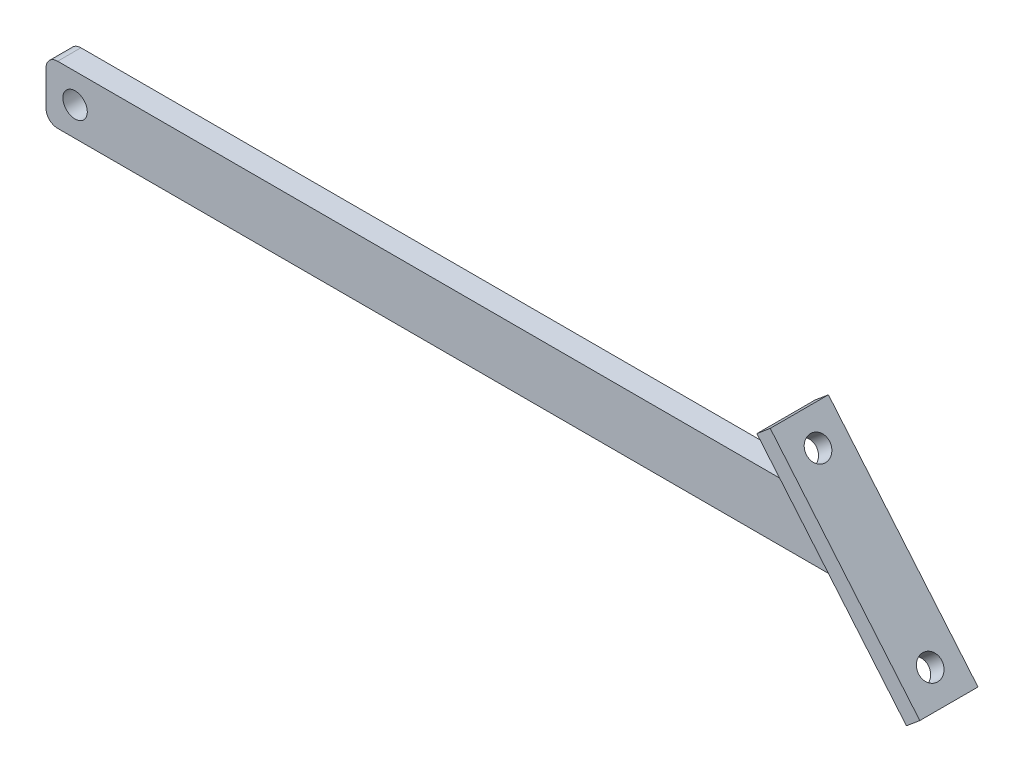
ISO-10303-21;
HEADER;
FILE_DESCRIPTION(('STEP AP214'),'2;1');
FILE_NAME('part.step','',(''),(''),'','','');
FILE_SCHEMA(('AUTOMOTIVE_DESIGN { 1 0 10303 214 1 1 1 1 }'));
ENDSEC;
DATA;
#1=APPLICATION_CONTEXT('core data for automotive mechanical design processes');
#2=APPLICATION_PROTOCOL_DEFINITION('international standard','automotive_design',2000,#1);
#3=PRODUCT_CONTEXT('',#1,'mechanical');
#4=PRODUCT('Part','Part','',(#3));
#5=PRODUCT_RELATED_PRODUCT_CATEGORY('part','',(#4));
#6=PRODUCT_DEFINITION_FORMATION('','',#4);
#7=PRODUCT_DEFINITION_CONTEXT('part definition',#1,'design');
#8=PRODUCT_DEFINITION('design','',#6,#7);
#9=PRODUCT_DEFINITION_SHAPE('','',#8);
#10=(LENGTH_UNIT() NAMED_UNIT(*) SI_UNIT(.MILLI.,.METRE.));
#11=(NAMED_UNIT(*) PLANE_ANGLE_UNIT() SI_UNIT($,.RADIAN.));
#12=(NAMED_UNIT(*) SI_UNIT($,.STERADIAN.) SOLID_ANGLE_UNIT());
#13=UNCERTAINTY_MEASURE_WITH_UNIT(LENGTH_MEASURE(1.E-05),#10,'distance_accuracy_value','');
#14=(GEOMETRIC_REPRESENTATION_CONTEXT(3) GLOBAL_UNCERTAINTY_ASSIGNED_CONTEXT((#13)) GLOBAL_UNIT_ASSIGNED_CONTEXT((#10,
#11,#12)) REPRESENTATION_CONTEXT('',''));
#15=CARTESIAN_POINT('',(0.,0.,0.));
#16=DIRECTION('',(0.,0.,1.));
#17=DIRECTION('',(1.,0.,0.));
#18=AXIS2_PLACEMENT_3D('',#15,#16,#17);
#19=CARTESIAN_POINT('',(0.,0.,4.));
#20=DIRECTION('',(0.,0.,1.));
#21=DIRECTION('',(1.,0.,0.));
#22=AXIS2_PLACEMENT_3D('',#19,#20,#21);
#23=PLANE('',#22);
#24=DIRECTION('',(0.,-1.,0.));
#25=VECTOR('',#24,1.);
#26=CARTESIAN_POINT('',(-14.8342541436464,5.27624309392265,4.));
#27=LINE('',#26,#25);
#28=CARTESIAN_POINT('',(-14.8342541436464,3.27624309392265,4.));
#29=VERTEX_POINT('',#28);
#30=CARTESIAN_POINT('',(-14.8342541436464,-2.72375690607735,4.));
#31=VERTEX_POINT('',#30);
#32=EDGE_CURVE('E151',#29,#31,#27,.T.);
#33=ORIENTED_EDGE('',*,*,#32,.T.);
#34=CARTESIAN_POINT('',(-12.8342541436464,-2.72375690607735,4.));
#35=DIRECTION('',(0.,0.,1.));
#36=DIRECTION('',(1.,0.,0.));
#37=AXIS2_PLACEMENT_3D('',#34,#35,#36);
#38=CIRCLE('',#37,2.);
#39=CARTESIAN_POINT('',(-12.8342541436464,-4.72375690607735,4.));
#40=VERTEX_POINT('',#39);
#41=EDGE_CURVE('E43',#31,#40,#38,.T.);
#42=ORIENTED_EDGE('',*,*,#41,.T.);
#43=DIRECTION('',(1.,0.,0.));
#44=VECTOR('',#43,1.);
#45=CARTESIAN_POINT('',(-14.8342541436464,-4.72375690607735,4.));
#46=LINE('',#45,#44);
#47=CARTESIAN_POINT('',(125.165745856354,-4.72375690607735,4.));
#48=VERTEX_POINT('',#47);
#49=EDGE_CURVE('E153',#40,#48,#46,.T.);
#50=ORIENTED_EDGE('',*,*,#49,.T.);
#51=DIRECTION('',(-0.642787609686544,0.766044443118974,0.));
#52=VECTOR('',#51,1.);
#53=CARTESIAN_POINT('',(125.165745856354,-4.72375690607735,4.));
#54=LINE('',#53,#52);
#55=CARTESIAN_POINT('',(116.774749544581,5.27624309392265,4.));
#56=VERTEX_POINT('',#55);
#57=EDGE_CURVE('E157',#48,#56,#54,.T.);
#58=ORIENTED_EDGE('',*,*,#57,.T.);
#59=DIRECTION('',(-1.,0.,0.));
#60=VECTOR('',#59,1.);
#61=CARTESIAN_POINT('',(-14.8342541436464,5.27624309392265,4.));
#62=LINE('',#61,#60);
#63=CARTESIAN_POINT('',(-12.8342541436464,5.27624309392265,4.));
#64=VERTEX_POINT('',#63);
#65=EDGE_CURVE('E160',#56,#64,#62,.T.);
#66=ORIENTED_EDGE('',*,*,#65,.T.);
#67=CARTESIAN_POINT('',(-12.8342541436464,3.27624309392265,4.));
#68=DIRECTION('',(0.,0.,1.));
#69=DIRECTION('',(1.,0.,0.));
#70=AXIS2_PLACEMENT_3D('',#67,#68,#69);
#71=CIRCLE('',#70,2.);
#72=EDGE_CURVE('E185',#64,#29,#71,.T.);
#73=ORIENTED_EDGE('',*,*,#72,.T.);
#74=EDGE_LOOP('',(#33,#42,#50,#58,#66,#73));
#75=FACE_BOUND('',#74,.T.);
#76=CARTESIAN_POINT('',(-9.8342541436464,0.276243093922653,4.));
#77=DIRECTION('',(0.,0.,1.));
#78=DIRECTION('',(1.,0.,0.));
#79=AXIS2_PLACEMENT_3D('',#76,#77,#78);
#80=CIRCLE('',#79,2.1);
#81=CARTESIAN_POINT('',(-7.7342541436464,0.276243093922653,4.));
#82=VERTEX_POINT('',#81);
#83=EDGE_CURVE('E142',#82,#82,#80,.T.);
#84=ORIENTED_EDGE('',*,*,#83,.F.);
#85=EDGE_LOOP('',(#84));
#86=FACE_BOUND('',#85,.T.);
#87=ADVANCED_FACE('F35',(#75,#86),#23,.T.);
#88=CARTESIAN_POINT('',(0.,0.,0.));
#89=DIRECTION('',(0.,0.,1.));
#90=DIRECTION('',(1.,0.,0.));
#91=AXIS2_PLACEMENT_3D('',#88,#89,#90);
#92=PLANE('',#91);
#93=DIRECTION('',(1.,0.,0.));
#94=VECTOR('',#93,1.);
#95=CARTESIAN_POINT('',(-14.8342541436464,-4.72375690607735,0.));
#96=LINE('',#95,#94);
#97=CARTESIAN_POINT('',(-12.8342541436464,-4.72375690607735,0.));
#98=VERTEX_POINT('',#97);
#99=CARTESIAN_POINT('',(125.165745856354,-4.72375690607736,0.));
#100=VERTEX_POINT('',#99);
#101=EDGE_CURVE('E164',#98,#100,#96,.T.);
#102=ORIENTED_EDGE('',*,*,#101,.F.);
#103=CARTESIAN_POINT('',(-12.8342541436464,-2.72375690607735,0.));
#104=DIRECTION('',(0.,0.,1.));
#105=DIRECTION('',(1.,0.,0.));
#106=AXIS2_PLACEMENT_3D('',#103,#104,#105);
#107=CIRCLE('',#106,2.);
#108=CARTESIAN_POINT('',(-14.8342541436464,-2.72375690607735,0.));
#109=VERTEX_POINT('',#108);
#110=EDGE_CURVE('E179',#98,#109,#107,.F.);
#111=ORIENTED_EDGE('',*,*,#110,.T.);
#112=DIRECTION('',(0.,-1.,0.));
#113=VECTOR('',#112,1.);
#114=CARTESIAN_POINT('',(-14.8342541436464,5.27624309392265,0.));
#115=LINE('',#114,#113);
#116=CARTESIAN_POINT('',(-14.8342541436464,3.27624309392265,0.));
#117=VERTEX_POINT('',#116);
#118=EDGE_CURVE('E149',#117,#109,#115,.T.);
#119=ORIENTED_EDGE('',*,*,#118,.F.);
#120=CARTESIAN_POINT('',(-12.8342541436464,3.27624309392265,0.));
#121=DIRECTION('',(0.,0.,1.));
#122=DIRECTION('',(1.,0.,0.));
#123=AXIS2_PLACEMENT_3D('',#120,#121,#122);
#124=CIRCLE('',#123,2.);
#125=CARTESIAN_POINT('',(-12.8342541436464,5.27624309392265,0.));
#126=VERTEX_POINT('',#125);
#127=EDGE_CURVE('E177',#117,#126,#124,.F.);
#128=ORIENTED_EDGE('',*,*,#127,.T.);
#129=DIRECTION('',(-1.,0.,0.));
#130=VECTOR('',#129,1.);
#131=CARTESIAN_POINT('',(-14.8342541436464,5.27624309392265,0.));
#132=LINE('',#131,#130);
#133=CARTESIAN_POINT('',(116.774749544581,5.27624309392265,0.));
#134=VERTEX_POINT('',#133);
#135=EDGE_CURVE('E154',#134,#126,#132,.T.);
#136=ORIENTED_EDGE('',*,*,#135,.F.);
#137=DIRECTION('',(-0.642787609686544,0.766044443118974,0.));
#138=VECTOR('',#137,1.);
#139=CARTESIAN_POINT('',(125.165745856354,-4.72375690607735,0.));
#140=LINE('',#139,#138);
#141=EDGE_CURVE('E167',#100,#134,#140,.T.);
#142=ORIENTED_EDGE('',*,*,#141,.F.);
#143=EDGE_LOOP('',(#102,#111,#119,#128,#136,#142));
#144=FACE_BOUND('',#143,.T.);
#145=CARTESIAN_POINT('',(-9.8342541436464,0.276243093922653,0.));
#146=DIRECTION('',(0.,0.,1.));
#147=DIRECTION('',(1.,0.,0.));
#148=AXIS2_PLACEMENT_3D('',#145,#146,#147);
#149=CIRCLE('',#148,2.1);
#150=CARTESIAN_POINT('',(-7.7342541436464,0.276243093922653,0.));
#151=VERTEX_POINT('',#150);
#152=EDGE_CURVE('E139',#151,#151,#149,.T.);
#153=ORIENTED_EDGE('',*,*,#152,.T.);
#154=EDGE_LOOP('',(#153));
#155=FACE_BOUND('',#154,.T.);
#156=ADVANCED_FACE('F199',(#144,#155),#92,.F.);
#157=CARTESIAN_POINT('',(-14.8342541436464,5.27624309392265,4.));
#158=DIRECTION('',(1.,0.,0.));
#159=DIRECTION('',(0.,0.,-1.));
#160=AXIS2_PLACEMENT_3D('',#157,#158,#159);
#161=PLANE('',#160);
#162=ORIENTED_EDGE('',*,*,#118,.T.);
#163=DIRECTION('',(0.,0.,-1.));
#164=VECTOR('',#163,1.);
#165=CARTESIAN_POINT('',(-14.8342541436464,-2.72375690607735,4.));
#166=LINE('',#165,#164);
#167=EDGE_CURVE('E56',#109,#31,#166,.F.);
#168=ORIENTED_EDGE('',*,*,#167,.T.);
#169=ORIENTED_EDGE('',*,*,#32,.F.);
#170=DIRECTION('',(0.,0.,-1.));
#171=VECTOR('',#170,1.);
#172=CARTESIAN_POINT('',(-14.8342541436464,3.27624309392265,4.));
#173=LINE('',#172,#171);
#174=EDGE_CURVE('E181',#29,#117,#173,.T.);
#175=ORIENTED_EDGE('',*,*,#174,.T.);
#176=EDGE_LOOP('',(#162,#168,#169,#175));
#177=FACE_BOUND('',#176,.T.);
#178=ADVANCED_FACE('F202',(#177),#161,.F.);
#179=CARTESIAN_POINT('',(-14.8342541436464,-4.72375690607735,4.));
#180=DIRECTION('',(0.,1.,0.));
#181=DIRECTION('',(-1.,0.,0.));
#182=AXIS2_PLACEMENT_3D('',#179,#180,#181);
#183=PLANE('',#182);
#184=ORIENTED_EDGE('',*,*,#49,.F.);
#185=DIRECTION('',(0.,0.,-1.));
#186=VECTOR('',#185,1.);
#187=CARTESIAN_POINT('',(-12.8342541436464,-4.72375690607735,4.));
#188=LINE('',#187,#186);
#189=EDGE_CURVE('E174',#40,#98,#188,.T.);
#190=ORIENTED_EDGE('',*,*,#189,.T.);
#191=ORIENTED_EDGE('',*,*,#101,.T.);
#192=DIRECTION('',(0.,0.,-1.));
#193=VECTOR('',#192,1.);
#194=CARTESIAN_POINT('',(125.165745856354,-4.72375690607735,4.));
#195=LINE('',#194,#193);
#196=EDGE_CURVE('E172',#48,#100,#195,.T.);
#197=ORIENTED_EDGE('',*,*,#196,.F.);
#198=EDGE_LOOP('',(#184,#190,#191,#197));
#199=FACE_BOUND('',#198,.T.);
#200=ADVANCED_FACE('F194',(#199),#183,.F.);
#201=CARTESIAN_POINT('',(-14.8342541436464,5.27624309392265,4.));
#202=DIRECTION('',(0.,-1.,0.));
#203=DIRECTION('',(0.,0.,-1.));
#204=AXIS2_PLACEMENT_3D('',#201,#202,#203);
#205=PLANE('',#204);
#206=ORIENTED_EDGE('',*,*,#135,.T.);
#207=DIRECTION('',(0.,0.,-1.));
#208=VECTOR('',#207,1.);
#209=CARTESIAN_POINT('',(-12.8342541436464,5.27624309392265,4.));
#210=LINE('',#209,#208);
#211=EDGE_CURVE('E11',#126,#64,#210,.F.);
#212=ORIENTED_EDGE('',*,*,#211,.T.);
#213=ORIENTED_EDGE('',*,*,#65,.F.);
#214=DIRECTION('',(0.,0.,-1.));
#215=VECTOR('',#214,1.);
#216=CARTESIAN_POINT('',(116.774749544581,5.27624309392265,4.));
#217=LINE('',#216,#215);
#218=EDGE_CURVE('E162',#56,#134,#217,.T.);
#219=ORIENTED_EDGE('',*,*,#218,.T.);
#220=EDGE_LOOP('',(#206,#212,#213,#219));
#221=FACE_BOUND('',#220,.T.);
#222=ADVANCED_FACE('F207',(#221),#205,.F.);
#223=CARTESIAN_POINT('',(-9.8342541436464,0.276243093922653,4.));
#224=DIRECTION('',(0.,0.,-1.));
#225=DIRECTION('',(-1.,0.,0.));
#226=AXIS2_PLACEMENT_3D('',#223,#224,#225);
#227=CYLINDRICAL_SURFACE('',#226,2.1);
#228=ORIENTED_EDGE('',*,*,#83,.T.);
#229=EDGE_LOOP('',(#228));
#230=FACE_BOUND('',#229,.T.);
#231=ORIENTED_EDGE('',*,*,#152,.F.);
#232=EDGE_LOOP('',(#231));
#233=FACE_BOUND('',#232,.T.);
#234=ADVANCED_FACE('F228',(#230,#233),#227,.F.);
#235=CARTESIAN_POINT('',(-12.8342541436464,-2.72375690607735,4.));
#236=DIRECTION('',(0.,0.,-1.));
#237=DIRECTION('',(-1.,0.,0.));
#238=AXIS2_PLACEMENT_3D('',#235,#236,#237);
#239=CYLINDRICAL_SURFACE('',#238,2.);
#240=ORIENTED_EDGE('',*,*,#41,.F.);
#241=ORIENTED_EDGE('',*,*,#167,.F.);
#242=ORIENTED_EDGE('',*,*,#110,.F.);
#243=ORIENTED_EDGE('',*,*,#189,.F.);
#244=EDGE_LOOP('',(#240,#241,#242,#243));
#245=FACE_BOUND('',#244,.T.);
#246=ADVANCED_FACE('F196',(#245),#239,.T.);
#247=CARTESIAN_POINT('',(-12.8342541436464,3.27624309392265,4.));
#248=DIRECTION('',(0.,0.,-1.));
#249=DIRECTION('',(-1.,0.,0.));
#250=AXIS2_PLACEMENT_3D('',#247,#248,#249);
#251=CYLINDRICAL_SURFACE('',#250,2.);
#252=ORIENTED_EDGE('',*,*,#72,.F.);
#253=ORIENTED_EDGE('',*,*,#211,.F.);
#254=ORIENTED_EDGE('',*,*,#127,.F.);
#255=ORIENTED_EDGE('',*,*,#174,.F.);
#256=EDGE_LOOP('',(#252,#253,#254,#255));
#257=FACE_BOUND('',#256,.T.);
#258=ADVANCED_FACE('F37',(#257),#251,.T.);
#259=CARTESIAN_POINT('',(71.1242785530901,59.6803559016487,-1.9097732933157E-13));
#260=DIRECTION('',(0.766044443118975,0.642787609686544,0.));
#261=DIRECTION('',(-0.642787609686544,0.766044443118975,0.));
#262=AXIS2_PLACEMENT_3D('',#259,#260,#261);
#263=PLANE('',#262);
#264=DIRECTION('',(0.642787609686544,-0.766044443118975,0.));
#265=VECTOR('',#264,1.);
#266=CARTESIAN_POINT('',(110.346873447715,12.9366875251124,7.));
#267=LINE('',#266,#265);
#268=CARTESIAN_POINT('',(110.346873447715,12.9366875251124,7.));
#269=VERTEX_POINT('',#268);
#270=CARTESIAN_POINT('',(136.058377835177,-17.7050901996466,7.));
#271=VERTEX_POINT('',#270);
#272=EDGE_CURVE('E370',#269,#271,#267,.T.);
#273=ORIENTED_EDGE('',*,*,#272,.F.);
#274=DIRECTION('',(0.,0.,1.));
#275=VECTOR('',#274,1.);
#276=CARTESIAN_POINT('',(110.346873447715,12.9366875251124,4.));
#277=LINE('',#276,#275);
#278=CARTESIAN_POINT('',(110.346873447715,12.9366875251124,-3.));
#279=VERTEX_POINT('',#278);
#280=EDGE_CURVE('E134',#279,#269,#277,.T.);
#281=ORIENTED_EDGE('',*,*,#280,.F.);
#282=DIRECTION('',(-0.642787609686544,0.766044443118975,0.));
#283=VECTOR('',#282,1.);
#284=CARTESIAN_POINT('',(110.346873447715,12.9366875251124,-3.));
#285=LINE('',#284,#283);
#286=CARTESIAN_POINT('',(136.058377835177,-17.7050901996466,-3.));
#287=VERTEX_POINT('',#286);
#288=EDGE_CURVE('E379',#287,#279,#285,.T.);
#289=ORIENTED_EDGE('',*,*,#288,.F.);
#290=DIRECTION('',(0.,0.,-1.));
#291=VECTOR('',#290,1.);
#292=CARTESIAN_POINT('',(136.058377835177,-17.7050901996466,7.));
#293=LINE('',#292,#291);
#294=EDGE_CURVE('E377',#271,#287,#293,.T.);
#295=ORIENTED_EDGE('',*,*,#294,.F.);
#296=EDGE_LOOP('',(#273,#281,#289,#295));
#297=FACE_BOUND('',#296,.T.);
#298=CARTESIAN_POINT('',(113.560811496148,9.10646530951752,2.));
#299=DIRECTION('',(0.766044443118974,0.642787609686544,0.));
#300=DIRECTION('',(-0.642787609686544,0.766044443118974,0.));
#301=AXIS2_PLACEMENT_3D('',#298,#299,#300);
#302=CIRCLE('',#301,2.00000000000001);
#303=CARTESIAN_POINT('',(112.275236276775,10.6385541957555,2.));
#304=VERTEX_POINT('',#303);
#305=EDGE_CURVE('E364',#304,#304,#302,.T.);
#306=ORIENTED_EDGE('',*,*,#305,.T.);
#307=EDGE_LOOP('',(#306));
#308=FACE_BOUND('',#307,.T.);
#309=CARTESIAN_POINT('',(132.844439786744,-13.8748679840517,2.));
#310=DIRECTION('',(0.766044443118974,0.642787609686544,0.));
#311=DIRECTION('',(-0.642787609686544,0.766044443118974,0.));
#312=AXIS2_PLACEMENT_3D('',#309,#310,#311);
#313=CIRCLE('',#312,2.);
#314=CARTESIAN_POINT('',(131.558864567371,-12.3427790978138,2.));
#315=VERTEX_POINT('',#314);
#316=EDGE_CURVE('E361',#315,#315,#313,.T.);
#317=ORIENTED_EDGE('',*,*,#316,.T.);
#318=EDGE_LOOP('',(#317));
#319=FACE_BOUND('',#318,.T.);
#320=ORIENTED_EDGE('',*,*,#57,.F.);
#321=ORIENTED_EDGE('',*,*,#196,.T.);
#322=ORIENTED_EDGE('',*,*,#141,.T.);
#323=ORIENTED_EDGE('',*,*,#218,.F.);
#324=EDGE_LOOP('',(#320,#321,#322,#323));
#325=FACE_BOUND('',#324,.T.);
#326=ADVANCED_FACE('F209',(#297,#308,#319,#325),#263,.F.);
#327=CARTESIAN_POINT('',(73.422411882447,61.6087187307083,-1.9097732933157E-13));
#328=DIRECTION('',(0.766044443118975,0.642787609686544,0.));
#329=DIRECTION('',(-0.642787609686544,0.766044443118975,0.));
#330=AXIS2_PLACEMENT_3D('',#327,#328,#329);
#331=PLANE('',#330);
#332=CARTESIAN_POINT('',(115.858944825505,11.0348281385772,2.));
#333=DIRECTION('',(0.766044443118974,0.642787609686544,0.));
#334=DIRECTION('',(-0.642787609686544,0.766044443118974,0.));
#335=AXIS2_PLACEMENT_3D('',#332,#333,#334);
#336=CIRCLE('',#335,2.00000000000001);
#337=CARTESIAN_POINT('',(114.573369606132,12.5669170248151,2.));
#338=VERTEX_POINT('',#337);
#339=EDGE_CURVE('E367',#338,#338,#336,.T.);
#340=ORIENTED_EDGE('',*,*,#339,.F.);
#341=EDGE_LOOP('',(#340));
#342=FACE_BOUND('',#341,.T.);
#343=DIRECTION('',(0.,0.,1.));
#344=VECTOR('',#343,1.);
#345=CARTESIAN_POINT('',(112.645006777072,14.865050354172,4.));
#346=LINE('',#345,#344);
#347=CARTESIAN_POINT('',(112.645006777072,14.865050354172,-3.));
#348=VERTEX_POINT('',#347);
#349=CARTESIAN_POINT('',(112.645006777072,14.865050354172,7.));
#350=VERTEX_POINT('',#349);
#351=EDGE_CURVE('E124',#348,#350,#346,.T.);
#352=ORIENTED_EDGE('',*,*,#351,.T.);
#353=DIRECTION('',(0.642787609686544,-0.766044443118975,0.));
#354=VECTOR('',#353,1.);
#355=CARTESIAN_POINT('',(112.645006777072,14.865050354172,7.));
#356=LINE('',#355,#354);
#357=CARTESIAN_POINT('',(138.356511164534,-15.776727370587,7.));
#358=VERTEX_POINT('',#357);
#359=EDGE_CURVE('E114',#350,#358,#356,.T.);
#360=ORIENTED_EDGE('',*,*,#359,.T.);
#361=DIRECTION('',(0.,0.,-1.));
#362=VECTOR('',#361,1.);
#363=CARTESIAN_POINT('',(138.356511164534,-15.776727370587,7.));
#364=LINE('',#363,#362);
#365=CARTESIAN_POINT('',(138.356511164534,-15.776727370587,-3.));
#366=VERTEX_POINT('',#365);
#367=EDGE_CURVE('E123',#358,#366,#364,.T.);
#368=ORIENTED_EDGE('',*,*,#367,.T.);
#369=DIRECTION('',(-0.642787609686544,0.766044443118975,0.));
#370=VECTOR('',#369,1.);
#371=CARTESIAN_POINT('',(112.645006777072,14.865050354172,-3.));
#372=LINE('',#371,#370);
#373=EDGE_CURVE('E130',#366,#348,#372,.T.);
#374=ORIENTED_EDGE('',*,*,#373,.T.);
#375=EDGE_LOOP('',(#352,#360,#368,#374));
#376=FACE_BOUND('',#375,.T.);
#377=CARTESIAN_POINT('',(135.142573116101,-11.9465051549921,2.));
#378=DIRECTION('',(0.766044443118974,0.642787609686544,0.));
#379=DIRECTION('',(-0.642787609686544,0.766044443118974,0.));
#380=AXIS2_PLACEMENT_3D('',#377,#378,#379);
#381=CIRCLE('',#380,2.);
#382=CARTESIAN_POINT('',(133.856997896728,-10.4144162687541,2.));
#383=VERTEX_POINT('',#382);
#384=EDGE_CURVE('E358',#383,#383,#381,.T.);
#385=ORIENTED_EDGE('',*,*,#384,.F.);
#386=EDGE_LOOP('',(#385));
#387=FACE_BOUND('',#386,.T.);
#388=ADVANCED_FACE('F127',(#342,#376,#387),#331,.T.);
#389=CARTESIAN_POINT('',(112.645006777072,14.865050354172,7.));
#390=DIRECTION('',(0.,0.,-1.));
#391=DIRECTION('',(0.,1.,0.));
#392=AXIS2_PLACEMENT_3D('',#389,#390,#391);
#393=PLANE('',#392);
#394=ORIENTED_EDGE('',*,*,#272,.T.);
#395=DIRECTION('',(-0.766044443118974,-0.642787609686544,0.));
#396=VECTOR('',#395,1.);
#397=CARTESIAN_POINT('',(138.356511164534,-15.776727370587,7.));
#398=LINE('',#397,#396);
#399=EDGE_CURVE('E120',#358,#271,#398,.T.);
#400=ORIENTED_EDGE('',*,*,#399,.F.);
#401=ORIENTED_EDGE('',*,*,#359,.F.);
#402=DIRECTION('',(-0.766044443118974,-0.642787609686544,0.));
#403=VECTOR('',#402,1.);
#404=CARTESIAN_POINT('',(112.645006777072,14.865050354172,7.));
#405=LINE('',#404,#403);
#406=EDGE_CURVE('E118',#350,#269,#405,.T.);
#407=ORIENTED_EDGE('',*,*,#406,.T.);
#408=EDGE_LOOP('',(#394,#400,#401,#407));
#409=FACE_BOUND('',#408,.T.);
#410=ADVANCED_FACE('F116',(#409),#393,.F.);
#411=CARTESIAN_POINT('',(138.356511164534,-15.776727370587,7.));
#412=DIRECTION('',(-0.642787609686544,0.766044443118974,0.));
#413=DIRECTION('',(-0.766044443118975,-0.642787609686544,0.));
#414=AXIS2_PLACEMENT_3D('',#411,#412,#413);
#415=PLANE('',#414);
#416=ORIENTED_EDGE('',*,*,#294,.T.);
#417=DIRECTION('',(-0.766044443118974,-0.642787609686544,0.));
#418=VECTOR('',#417,1.);
#419=CARTESIAN_POINT('',(138.356511164534,-15.776727370587,-3.));
#420=LINE('',#419,#418);
#421=EDGE_CURVE('E144',#366,#287,#420,.T.);
#422=ORIENTED_EDGE('',*,*,#421,.F.);
#423=ORIENTED_EDGE('',*,*,#367,.F.);
#424=ORIENTED_EDGE('',*,*,#399,.T.);
#425=EDGE_LOOP('',(#416,#422,#423,#424));
#426=FACE_BOUND('',#425,.T.);
#427=ADVANCED_FACE('F303',(#426),#415,.F.);
#428=CARTESIAN_POINT('',(112.645006777072,14.865050354172,-3.));
#429=DIRECTION('',(0.,0.,1.));
#430=DIRECTION('',(0.,-1.,0.));
#431=AXIS2_PLACEMENT_3D('',#428,#429,#430);
#432=PLANE('',#431);
#433=ORIENTED_EDGE('',*,*,#288,.T.);
#434=DIRECTION('',(-0.766044443118974,-0.642787609686544,0.));
#435=VECTOR('',#434,1.);
#436=CARTESIAN_POINT('',(112.645006777072,14.865050354172,-3.));
#437=LINE('',#436,#435);
#438=EDGE_CURVE('E375',#348,#279,#437,.T.);
#439=ORIENTED_EDGE('',*,*,#438,.F.);
#440=ORIENTED_EDGE('',*,*,#373,.F.);
#441=ORIENTED_EDGE('',*,*,#421,.T.);
#442=EDGE_LOOP('',(#433,#439,#440,#441));
#443=FACE_BOUND('',#442,.T.);
#444=ADVANCED_FACE('F310',(#443),#432,.F.);
#445=CARTESIAN_POINT('',(112.645006777072,14.865050354172,4.));
#446=DIRECTION('',(0.642787609686544,-0.766044443118974,0.));
#447=DIRECTION('',(0.766044443118975,0.642787609686544,0.));
#448=AXIS2_PLACEMENT_3D('',#445,#446,#447);
#449=PLANE('',#448);
#450=ORIENTED_EDGE('',*,*,#280,.T.);
#451=ORIENTED_EDGE('',*,*,#406,.F.);
#452=ORIENTED_EDGE('',*,*,#351,.F.);
#453=ORIENTED_EDGE('',*,*,#438,.T.);
#454=EDGE_LOOP('',(#450,#451,#452,#453));
#455=FACE_BOUND('',#454,.T.);
#456=ADVANCED_FACE('F136',(#455),#449,.F.);
#457=CARTESIAN_POINT('',(115.858944825505,11.0348281385772,2.));
#458=DIRECTION('',(-0.766044443118974,-0.642787609686544,0.));
#459=DIRECTION('',(0.642787609686544,-0.766044443118975,0.));
#460=AXIS2_PLACEMENT_3D('',#457,#458,#459);
#461=CYLINDRICAL_SURFACE('',#460,2.00000000000001);
#462=ORIENTED_EDGE('',*,*,#339,.T.);
#463=EDGE_LOOP('',(#462));
#464=FACE_BOUND('',#463,.T.);
#465=ORIENTED_EDGE('',*,*,#305,.F.);
#466=EDGE_LOOP('',(#465));
#467=FACE_BOUND('',#466,.T.);
#468=ADVANCED_FACE('F327',(#464,#467),#461,.F.);
#469=CARTESIAN_POINT('',(135.142573116101,-11.9465051549921,2.));
#470=DIRECTION('',(-0.766044443118974,-0.642787609686544,0.));
#471=DIRECTION('',(0.642787609686544,-0.766044443118975,0.));
#472=AXIS2_PLACEMENT_3D('',#469,#470,#471);
#473=CYLINDRICAL_SURFACE('',#472,2.);
#474=ORIENTED_EDGE('',*,*,#384,.T.);
#475=EDGE_LOOP('',(#474));
#476=FACE_BOUND('',#475,.T.);
#477=ORIENTED_EDGE('',*,*,#316,.F.);
#478=EDGE_LOOP('',(#477));
#479=FACE_BOUND('',#478,.T.);
#480=ADVANCED_FACE('F337',(#476,#479),#473,.F.);
#481=CLOSED_SHELL('',(#87,#156,#178,#200,#222,#234,#246,#258,#326,#388,#410,#427,#444,#456,#468,#480));
#482=MANIFOLD_SOLID_BREP('B2',#481);
#483=ADVANCED_BREP_SHAPE_REPRESENTATION('',(#18,#482),#14);
#484=SHAPE_DEFINITION_REPRESENTATION(#9,#483);
ENDSEC;
END-ISO-10303-21;
